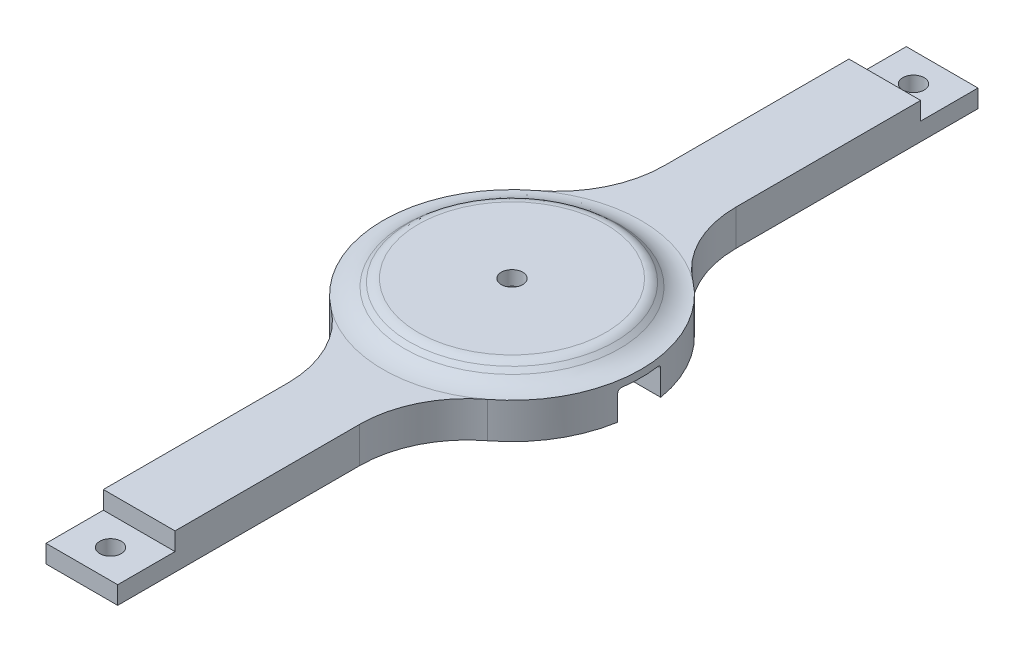
ISO-10303-21;
HEADER;
FILE_DESCRIPTION(('STEP AP214'),'2;1');
FILE_NAME('part.step','',(''),(''),'','','');
FILE_SCHEMA(('AUTOMOTIVE_DESIGN { 1 0 10303 214 1 1 1 1 }'));
ENDSEC;
DATA;
#1=APPLICATION_CONTEXT('core data for automotive mechanical design processes');
#2=APPLICATION_PROTOCOL_DEFINITION('international standard','automotive_design',2000,#1);
#3=PRODUCT_CONTEXT('',#1,'mechanical');
#4=PRODUCT('Part','Part','',(#3));
#5=PRODUCT_RELATED_PRODUCT_CATEGORY('part','',(#4));
#6=PRODUCT_DEFINITION_FORMATION('','',#4);
#7=PRODUCT_DEFINITION_CONTEXT('part definition',#1,'design');
#8=PRODUCT_DEFINITION('design','',#6,#7);
#9=PRODUCT_DEFINITION_SHAPE('','',#8);
#10=(LENGTH_UNIT() NAMED_UNIT(*) SI_UNIT(.MILLI.,.METRE.));
#11=(NAMED_UNIT(*) PLANE_ANGLE_UNIT() SI_UNIT($,.RADIAN.));
#12=(NAMED_UNIT(*) SI_UNIT($,.STERADIAN.) SOLID_ANGLE_UNIT());
#13=UNCERTAINTY_MEASURE_WITH_UNIT(LENGTH_MEASURE(1.E-05),#10,'distance_accuracy_value','');
#14=(GEOMETRIC_REPRESENTATION_CONTEXT(3) GLOBAL_UNCERTAINTY_ASSIGNED_CONTEXT((#13)) GLOBAL_UNIT_ASSIGNED_CONTEXT((#10,
#11,#12)) REPRESENTATION_CONTEXT('',''));
#15=CARTESIAN_POINT('',(0.,0.,0.));
#16=DIRECTION('',(0.,0.,1.));
#17=DIRECTION('',(1.,0.,0.));
#18=AXIS2_PLACEMENT_3D('',#15,#16,#17);
#19=CARTESIAN_POINT('',(0.,-5.,0.));
#20=DIRECTION('',(0.,-1.,0.));
#21=DIRECTION('',(0.,0.,-1.));
#22=AXIS2_PLACEMENT_3D('',#19,#20,#21);
#23=PLANE('',#22);
#24=CARTESIAN_POINT('',(0.,-5.,56.));
#25=DIRECTION('',(0.,-1.,0.));
#26=DIRECTION('',(0.,0.,-1.));
#27=AXIS2_PLACEMENT_3D('',#24,#25,#26);
#28=CIRCLE('',#27,1.5);
#29=CARTESIAN_POINT('',(0.,-5.,54.5));
#30=VERTEX_POINT('',#29);
#31=EDGE_CURVE('E181',#30,#30,#28,.T.);
#32=ORIENTED_EDGE('',*,*,#31,.F.);
#33=EDGE_LOOP('',(#32));
#34=FACE_BOUND('',#33,.T.);
#35=CARTESIAN_POINT('',(0.,-5.,-56.));
#36=DIRECTION('',(0.,1.,0.));
#37=DIRECTION('',(0.,0.,1.));
#38=AXIS2_PLACEMENT_3D('',#35,#36,#37);
#39=CIRCLE('',#38,1.5);
#40=CARTESIAN_POINT('',(0.,-5.,-54.5));
#41=VERTEX_POINT('',#40);
#42=EDGE_CURVE('E184',#41,#41,#39,.T.);
#43=ORIENTED_EDGE('',*,*,#42,.T.);
#44=EDGE_LOOP('',(#43));
#45=FACE_BOUND('',#44,.T.);
#46=CARTESIAN_POINT('',(0.,-5.,0.));
#47=DIRECTION('',(0.,1.,0.));
#48=DIRECTION('',(0.,0.,1.));
#49=AXIS2_PLACEMENT_3D('',#46,#47,#48);
#50=CIRCLE('',#49,18.);
#51=CARTESIAN_POINT('',(17.7482393492989,-5.,-3.));
#52=VERTEX_POINT('',#51);
#53=CARTESIAN_POINT('',(10.9090909090909,-5.,-14.3175324528073));
#54=VERTEX_POINT('',#53);
#55=EDGE_CURVE('E171',#52,#54,#50,.T.);
#56=ORIENTED_EDGE('',*,*,#55,.F.);
#57=DIRECTION('',(-1.,0.,0.));
#58=VECTOR('',#57,1.);
#59=CARTESIAN_POINT('',(0.,-5.,-3.));
#60=LINE('',#59,#58);
#61=CARTESIAN_POINT('',(10.2187327981507,-5.,-2.99999999999999));
#62=VERTEX_POINT('',#61);
#63=EDGE_CURVE('E525',#52,#62,#60,.T.);
#64=ORIENTED_EDGE('',*,*,#63,.T.);
#65=CARTESIAN_POINT('',(0.,-5.,0.));
#66=DIRECTION('',(0.,-1.,0.));
#67=DIRECTION('',(0.,0.,-1.));
#68=AXIS2_PLACEMENT_3D('',#65,#66,#67);
#69=CIRCLE('',#68,10.65);
#70=CARTESIAN_POINT('',(10.2187327981507,-5.,3.00000000000001));
#71=VERTEX_POINT('',#70);
#72=EDGE_CURVE('E328',#71,#62,#69,.T.);
#73=ORIENTED_EDGE('',*,*,#72,.F.);
#74=DIRECTION('',(1.,0.,0.));
#75=VECTOR('',#74,1.);
#76=CARTESIAN_POINT('',(0.,-5.,3.));
#77=LINE('',#76,#75);
#78=CARTESIAN_POINT('',(17.7482393492989,-5.,3.));
#79=VERTEX_POINT('',#78);
#80=EDGE_CURVE('E512',#71,#79,#77,.T.);
#81=ORIENTED_EDGE('',*,*,#80,.T.);
#82=CARTESIAN_POINT('',(10.9090909090909,-5.,14.3175324528073));
#83=VERTEX_POINT('',#82);
#84=EDGE_CURVE('E167',#83,#79,#50,.T.);
#85=ORIENTED_EDGE('',*,*,#84,.F.);
#86=CARTESIAN_POINT('',(20.,-5.,26.2488094968134));
#87=DIRECTION('',(0.,-1.,0.));
#88=DIRECTION('',(0.,0.,-1.));
#89=AXIS2_PLACEMENT_3D('',#86,#87,#88);
#90=CIRCLE('',#89,15.);
#91=CARTESIAN_POINT('',(5.,-5.,26.2488094968134));
#92=VERTEX_POINT('',#91);
#93=EDGE_CURVE('E12',#83,#92,#90,.F.);
#94=ORIENTED_EDGE('',*,*,#93,.T.);
#95=DIRECTION('',(0.,0.,-1.));
#96=VECTOR('',#95,1.);
#97=CARTESIAN_POINT('',(5.00000000000001,-5.,0.));
#98=LINE('',#97,#96);
#99=CARTESIAN_POINT('',(5.,-5.,60.));
#100=VERTEX_POINT('',#99);
#101=EDGE_CURVE('E123',#100,#92,#98,.T.);
#102=ORIENTED_EDGE('',*,*,#101,.F.);
#103=DIRECTION('',(1.,0.,0.));
#104=VECTOR('',#103,1.);
#105=CARTESIAN_POINT('',(45.,-5.,60.));
#106=LINE('',#105,#104);
#107=CARTESIAN_POINT('',(-5.,-5.,60.));
#108=VERTEX_POINT('',#107);
#109=EDGE_CURVE('E187',#108,#100,#106,.T.);
#110=ORIENTED_EDGE('',*,*,#109,.F.);
#111=DIRECTION('',(0.,0.,-1.));
#112=VECTOR('',#111,1.);
#113=CARTESIAN_POINT('',(-5.00000000000001,-5.,0.));
#114=LINE('',#113,#112);
#115=CARTESIAN_POINT('',(-5.,-5.,26.2488094968134));
#116=VERTEX_POINT('',#115);
#117=EDGE_CURVE('E353',#108,#116,#114,.T.);
#118=ORIENTED_EDGE('',*,*,#117,.T.);
#119=CARTESIAN_POINT('',(-20.,-5.,26.2488094968134));
#120=DIRECTION('',(0.,-1.,0.));
#121=DIRECTION('',(0.,0.,-1.));
#122=AXIS2_PLACEMENT_3D('',#119,#120,#121);
#123=CIRCLE('',#122,15.);
#124=CARTESIAN_POINT('',(-10.9090909090909,-5.,14.3175324528073));
#125=VERTEX_POINT('',#124);
#126=EDGE_CURVE('E113',#116,#125,#123,.F.);
#127=ORIENTED_EDGE('',*,*,#126,.T.);
#128=CARTESIAN_POINT('',(0.,-5.,0.));
#129=DIRECTION('',(0.,-1.,0.));
#130=DIRECTION('',(0.,0.,1.));
#131=AXIS2_PLACEMENT_3D('',#128,#129,#130);
#132=CIRCLE('',#131,18.);
#133=CARTESIAN_POINT('',(-10.9090909090909,-5.,-14.3175324528073));
#134=VERTEX_POINT('',#133);
#135=EDGE_CURVE('E362',#125,#134,#132,.T.);
#136=ORIENTED_EDGE('',*,*,#135,.T.);
#137=CARTESIAN_POINT('',(-20.,-5.,-26.2488094968134));
#138=DIRECTION('',(0.,-1.,0.));
#139=DIRECTION('',(0.,0.,-1.));
#140=AXIS2_PLACEMENT_3D('',#137,#138,#139);
#141=CIRCLE('',#140,15.);
#142=CARTESIAN_POINT('',(-5.,-5.,-26.2488094968134));
#143=VERTEX_POINT('',#142);
#144=EDGE_CURVE('E469',#134,#143,#141,.F.);
#145=ORIENTED_EDGE('',*,*,#144,.T.);
#146=DIRECTION('',(0.,0.,1.));
#147=VECTOR('',#146,1.);
#148=CARTESIAN_POINT('',(-5.00000000000001,-5.,0.));
#149=LINE('',#148,#147);
#150=CARTESIAN_POINT('',(-5.,-5.,-60.));
#151=VERTEX_POINT('',#150);
#152=EDGE_CURVE('E137',#151,#143,#149,.T.);
#153=ORIENTED_EDGE('',*,*,#152,.F.);
#154=DIRECTION('',(-1.,0.,0.));
#155=VECTOR('',#154,1.);
#156=CARTESIAN_POINT('',(-45.,-5.,-60.));
#157=LINE('',#156,#155);
#158=CARTESIAN_POINT('',(5.,-5.,-60.));
#159=VERTEX_POINT('',#158);
#160=EDGE_CURVE('E190',#159,#151,#157,.T.);
#161=ORIENTED_EDGE('',*,*,#160,.F.);
#162=DIRECTION('',(0.,0.,1.));
#163=VECTOR('',#162,1.);
#164=CARTESIAN_POINT('',(5.00000000000001,-5.,0.));
#165=LINE('',#164,#163);
#166=CARTESIAN_POINT('',(5.,-5.,-26.2488094968134));
#167=VERTEX_POINT('',#166);
#168=EDGE_CURVE('E170',#159,#167,#165,.T.);
#169=ORIENTED_EDGE('',*,*,#168,.T.);
#170=CARTESIAN_POINT('',(20.,-5.,-26.2488094968134));
#171=DIRECTION('',(0.,-1.,0.));
#172=DIRECTION('',(0.,0.,-1.));
#173=AXIS2_PLACEMENT_3D('',#170,#171,#172);
#174=CIRCLE('',#173,15.);
#175=EDGE_CURVE('E466',#167,#54,#174,.F.);
#176=ORIENTED_EDGE('',*,*,#175,.T.);
#177=EDGE_LOOP('',(#56,#64,#73,#81,#85,#94,#102,#110,#118,#127,#136,#145,#153,#161,#169,#176));
#178=FACE_BOUND('',#177,.T.);
#179=ADVANCED_FACE('F45',(#34,#45,#178),#23,.T.);
#180=CARTESIAN_POINT('',(0.,-5.,0.));
#181=DIRECTION('',(0.,1.,0.));
#182=DIRECTION('',(0.,0.,1.));
#183=AXIS2_PLACEMENT_3D('',#180,#181,#182);
#184=CYLINDRICAL_SURFACE('',#183,18.);
#185=ORIENTED_EDGE('',*,*,#55,.T.);
#186=DIRECTION('',(0.,1.,0.));
#187=VECTOR('',#186,1.);
#188=CARTESIAN_POINT('',(10.9090909090909,-5.,-14.3175324528073));
#189=LINE('',#188,#187);
#190=CARTESIAN_POINT('',(10.9090909090909,0.,-14.3175324528073));
#191=VERTEX_POINT('',#190);
#192=EDGE_CURVE('E454',#54,#191,#189,.T.);
#193=ORIENTED_EDGE('',*,*,#192,.T.);
#194=CARTESIAN_POINT('',(0.,0.,0.));
#195=DIRECTION('',(0.,1.,0.));
#196=DIRECTION('',(0.,0.,1.));
#197=AXIS2_PLACEMENT_3D('',#194,#195,#196);
#198=CIRCLE('',#197,18.);
#199=CARTESIAN_POINT('',(10.9090909090909,0.,14.3175324528073));
#200=VERTEX_POINT('',#199);
#201=EDGE_CURVE('E166',#200,#191,#198,.T.);
#202=ORIENTED_EDGE('',*,*,#201,.F.);
#203=DIRECTION('',(0.,1.,0.));
#204=VECTOR('',#203,1.);
#205=CARTESIAN_POINT('',(10.9090909090909,-5.,14.3175324528073));
#206=LINE('',#205,#204);
#207=EDGE_CURVE('E111',#200,#83,#206,.F.);
#208=ORIENTED_EDGE('',*,*,#207,.T.);
#209=ORIENTED_EDGE('',*,*,#84,.T.);
#210=DIRECTION('',(0.,1.,0.));
#211=VECTOR('',#210,1.);
#212=CARTESIAN_POINT('',(17.7482393492989,-5.,3.));
#213=LINE('',#212,#211);
#214=CARTESIAN_POINT('',(17.7482393492989,-1.5,3.));
#215=VERTEX_POINT('',#214);
#216=EDGE_CURVE('E516',#79,#215,#213,.T.);
#217=ORIENTED_EDGE('',*,*,#216,.T.);
#218=CARTESIAN_POINT('',(17.7482393492989,-1.5,3.));
#219=CARTESIAN_POINT('',(17.7482332357757,-1.47214135832498,3.00002511288223));
#220=CARTESIAN_POINT('',(17.7486326132973,-1.44429255025681,2.99767326426672));
#221=CARTESIAN_POINT('',(17.7501966128589,-1.38942090953694,2.98840421971169));
#222=CARTESIAN_POINT('',(17.7513603011444,-1.362397111079,2.98149259438176));
#223=CARTESIAN_POINT('',(17.7544078819667,-1.30990160032884,2.96328879130655));
#224=CARTESIAN_POINT('',(17.7562920073524,-1.28443039293085,2.95199519726994));
#225=CARTESIAN_POINT('',(17.7606971690626,-1.23575545229187,2.92537495091207));
#226=CARTESIAN_POINT('',(17.7632181746881,-1.21255160983329,2.91004849298285));
#227=CARTESIAN_POINT('',(17.7688125685304,-1.168891878979,2.87569184509768));
#228=CARTESIAN_POINT('',(17.7718895446955,-1.14845544439775,2.85663752711052));
#229=CARTESIAN_POINT('',(17.7784634775824,-1.1110586884189,2.81543440395894));
#230=CARTESIAN_POINT('',(17.7819605306431,-1.09409916682641,2.79328488876274));
#231=CARTESIAN_POINT('',(17.7892913883295,-1.06391380871787,2.74621301206353));
#232=CARTESIAN_POINT('',(17.7931289566603,-1.05073898527791,2.72125855286285));
#233=CARTESIAN_POINT('',(17.8009650265794,-1.02877550958106,2.66951815515013));
#234=CARTESIAN_POINT('',(17.8049634530886,-1.01998483614863,2.64273306708039));
#235=CARTESIAN_POINT('',(17.8117509263368,-1.00901865267783,2.59651580685795));
#236=CARTESIAN_POINT('',(17.8145332458628,-1.00563967750726,2.57735921652682));
#237=CARTESIAN_POINT('',(17.8200686895053,-1.00113040024699,2.53880584109007));
#238=CARTESIAN_POINT('',(17.8228218479138,-0.999997073888601,2.51940941447193));
#239=CARTESIAN_POINT('',(17.8255434699759,-1.,2.5));
#240=B_SPLINE_CURVE_WITH_KNOTS('',3,(#218,#219,#220,#221,#222,#223,#224,#225,#226,#227,#228,
#229,#230,#231,#232,#233,#234,#235,#236,#237,#238,#239),.UNSPECIFIED.,.F.,.F.,(4,2,2,2,2,2,2,2,
2,2,4),(0.,0.0834593783557437,0.166816984008042,0.250201554053615,0.333582105533117,
0.417521331287892,0.501479844231925,0.586521951437317,0.671524816307738,0.730352939897004,
0.789101784259888),.UNSPECIFIED.);
#241=CARTESIAN_POINT('',(17.8255434699759,-1.,2.5));
#242=VERTEX_POINT('',#241);
#243=EDGE_CURVE('E266',#215,#242,#240,.T.);
#244=ORIENTED_EDGE('',*,*,#243,.T.);
#245=CARTESIAN_POINT('',(0.,-1.,0.));
#246=DIRECTION('',(0.,-1.,0.));
#247=DIRECTION('',(0.,0.,-1.));
#248=AXIS2_PLACEMENT_3D('',#245,#246,#247);
#249=CIRCLE('',#248,18.);
#250=CARTESIAN_POINT('',(17.8255434699759,-1.,-2.5));
#251=VERTEX_POINT('',#250);
#252=EDGE_CURVE('E522',#242,#251,#249,.F.);
#253=ORIENTED_EDGE('',*,*,#252,.T.);
#254=CARTESIAN_POINT('',(17.8255434699759,-1.,-2.5));
#255=CARTESIAN_POINT('',(17.8215635041767,-0.999977456937952,-2.52839700167244));
#256=CARTESIAN_POINT('',(17.8175115342559,-1.00241778763535,-2.55677663968135));
#257=CARTESIAN_POINT('',(17.8093955318247,-1.01204807396821,-2.61270040708748));
#258=CARTESIAN_POINT('',(17.8053315075925,-1.01923529699408,-2.64024500764895));
#259=CARTESIAN_POINT('',(17.7973164977203,-1.03818827376845,-2.6937455264005));
#260=CARTESIAN_POINT('',(17.7933655685899,-1.04995627493401,-2.71970065752138));
#261=CARTESIAN_POINT('',(17.785719239699,-1.07773967941705,-2.76926319817921));
#262=CARTESIAN_POINT('',(17.7820237857132,-1.09375417789213,-2.79287110638999));
#263=CARTESIAN_POINT('',(17.7750370026888,-1.12954465799603,-2.83699817145587));
#264=CARTESIAN_POINT('',(17.7717445780707,-1.14931005218867,-2.85752573777014));
#265=CARTESIAN_POINT('',(17.765684059728,-1.19208871786546,-2.89496640162274));
#266=CARTESIAN_POINT('',(17.7629160507354,-1.21510251316101,-2.91187891511826));
#267=CARTESIAN_POINT('',(17.7580491141909,-1.26346494897521,-2.94141364187764));
#268=CARTESIAN_POINT('',(17.7559435238328,-1.28878680068963,-2.95407866914052));
#269=CARTESIAN_POINT('',(17.7524563316193,-1.34123906866283,-2.97496338839218));
#270=CARTESIAN_POINT('',(17.7510741668281,-1.36836806010287,-2.98318653700195));
#271=CARTESIAN_POINT('',(17.7494725122149,-1.41307955814933,-2.99269758357861));
#272=CARTESIAN_POINT('',(17.74901065486,-1.43035867540672,-2.99543428314725));
#273=CARTESIAN_POINT('',(17.7483939980804,-1.46508919604898,-2.99908512453727));
#274=CARTESIAN_POINT('',(17.7482387685522,-1.48254032355202,-3.00000181926998));
#275=CARTESIAN_POINT('',(17.7482393492989,-1.5,-3.));
#276=B_SPLINE_CURVE_WITH_KNOTS('',3,(#254,#255,#256,#257,#258,#259,#260,#261,#262,#263,#264,
#265,#266,#267,#268,#269,#270,#271,#272,#273,#274,#275),.UNSPECIFIED.,.F.,.F.,(4,2,2,2,2,2,2,2,
2,2,4),(0.,0.0859098990105212,0.171770385938038,0.257673050858917,0.343557426353802,
0.42920289280652,0.514862185578664,0.599630096797464,0.684331947180204,0.736743153169506,
0.789080790145875),.UNSPECIFIED.);
#277=CARTESIAN_POINT('',(17.7482393492989,-1.5,-3.));
#278=VERTEX_POINT('',#277);
#279=EDGE_CURVE('E231',#251,#278,#276,.T.);
#280=ORIENTED_EDGE('',*,*,#279,.T.);
#281=DIRECTION('',(0.,1.,0.));
#282=VECTOR('',#281,1.);
#283=CARTESIAN_POINT('',(17.7482393492989,-5.,-3.));
#284=LINE('',#283,#282);
#285=EDGE_CURVE('E531',#278,#52,#284,.F.);
#286=ORIENTED_EDGE('',*,*,#285,.T.);
#287=EDGE_LOOP('',(#185,#193,#202,#208,#209,#217,#244,#253,#280,#286));
#288=FACE_BOUND('',#287,.T.);
#289=ADVANCED_FACE('F274',(#288),#184,.T.);
#290=CARTESIAN_POINT('',(0.,32.1227488785469,0.));
#291=DIRECTION('',(0.,-1.,0.));
#292=DIRECTION('',(0.,0.,-1.));
#293=AXIS2_PLACEMENT_3D('',#290,#291,#292);
#294=CYLINDRICAL_SURFACE('',#293,10.65);
#295=CARTESIAN_POINT('',(0.,0.,0.));
#296=DIRECTION('',(0.,1.,0.));
#297=DIRECTION('',(0.,0.,1.));
#298=AXIS2_PLACEMENT_3D('',#295,#296,#297);
#299=CIRCLE('',#298,10.65);
#300=CARTESIAN_POINT('',(0.,0.,10.65));
#301=VERTEX_POINT('',#300);
#302=EDGE_CURVE('E323',#301,#301,#299,.F.);
#303=ORIENTED_EDGE('',*,*,#302,.F.);
#304=EDGE_LOOP('',(#303));
#305=FACE_BOUND('',#304,.T.);
#306=DIRECTION('',(0.,-1.,0.));
#307=VECTOR('',#306,1.);
#308=CARTESIAN_POINT('',(10.2187327981507,32.1227488785469,-2.99999999999999));
#309=LINE('',#308,#307);
#310=CARTESIAN_POINT('',(10.2187327981507,-1.49999999999999,-2.99999999999999));
#311=VERTEX_POINT('',#310);
#312=EDGE_CURVE('E207',#311,#62,#309,.T.);
#313=ORIENTED_EDGE('',*,*,#312,.F.);
#314=CARTESIAN_POINT('',(10.2187327981507,-1.5,-3.));
#315=CARTESIAN_POINT('',(10.2187216681149,-1.47265123474762,-3.00002723235999));
#316=CARTESIAN_POINT('',(10.21939098074,-1.44531736900103,-2.99775795991905));
#317=CARTESIAN_POINT('',(10.2220053952499,-1.39149177379419,-2.98883657551772));
#318=CARTESIAN_POINT('',(10.2239479183332,-1.36499845533774,-2.98219332263549));
#319=CARTESIAN_POINT('',(10.2290243455867,-1.31354910237764,-2.96473240172497));
#320=CARTESIAN_POINT('',(10.2321582791716,-1.28859310584649,-2.95391463063221));
#321=CARTESIAN_POINT('',(10.239470309353,-1.24087393858463,-2.92846779080597));
#322=CARTESIAN_POINT('',(10.2436486008867,-1.21811117833813,-2.91383801051077));
#323=CARTESIAN_POINT('',(10.2529607445105,-1.17493786837911,-2.88090144867071));
#324=CARTESIAN_POINT('',(10.2581112551699,-1.15458027358462,-2.86253004126005));
#325=CARTESIAN_POINT('',(10.2691077706384,-1.11721206123179,-2.82282650574179));
#326=CARTESIAN_POINT('',(10.2749539698289,-1.10020238264967,-2.80149354987367));
#327=CARTESIAN_POINT('',(10.2873564650718,-1.06935338448562,-2.75560913679629));
#328=CARTESIAN_POINT('',(10.2939311047944,-1.05565583599915,-2.73096736434357));
#329=CARTESIAN_POINT('',(10.3073683620234,-1.03260633997964,-2.67980524965893));
#330=CARTESIAN_POINT('',(10.3142309139835,-1.02325340914042,-2.6532853340698));
#331=CARTESIAN_POINT('',(10.3263630450094,-1.01081651023281,-2.60560490001243));
#332=CARTESIAN_POINT('',(10.3316192735973,-1.0067663221816,-2.58468732388586));
#333=CARTESIAN_POINT('',(10.3420773718742,-1.00135767947077,-2.54252117538642));
#334=CARTESIAN_POINT('',(10.3472792996172,-0.999995975331516,-2.52127303391849));
#335=CARTESIAN_POINT('',(10.3524151771459,-1.,-2.5));
#336=B_SPLINE_CURVE_WITH_KNOTS('',3,(#314,#315,#316,#317,#318,#319,#320,#321,#322,#323,#324,
#325,#326,#327,#328,#329,#330,#331,#332,#333,#334,#335),.UNSPECIFIED.,.F.,.F.,(4,2,2,2,2,2,2,2,
2,2,4),(0.,0.0819213543459317,0.163677293160185,0.245435250571485,0.327208480128655,
0.410536558991545,0.493887975338273,0.58034560735258,0.666783662086927,0.732457241867842,
0.798051395500657),.UNSPECIFIED.);
#337=CARTESIAN_POINT('',(10.3524151771459,-1.,-2.5));
#338=VERTEX_POINT('',#337);
#339=EDGE_CURVE('E222',#311,#338,#336,.T.);
#340=ORIENTED_EDGE('',*,*,#339,.T.);
#341=CARTESIAN_POINT('',(0.,-1.,0.));
#342=DIRECTION('',(0.,-1.,0.));
#343=DIRECTION('',(0.,0.,-1.));
#344=AXIS2_PLACEMENT_3D('',#341,#342,#343);
#345=CIRCLE('',#344,10.65);
#346=CARTESIAN_POINT('',(10.3524151771459,-1.,2.5));
#347=VERTEX_POINT('',#346);
#348=EDGE_CURVE('E204',#347,#338,#345,.F.);
#349=ORIENTED_EDGE('',*,*,#348,.F.);
#350=CARTESIAN_POINT('',(10.3524151771459,-1.,2.5));
#351=CARTESIAN_POINT('',(10.3454343325229,-0.999980281946966,2.52892781124622));
#352=CARTESIAN_POINT('',(10.3383248237783,-1.00250916693394,2.5578169113411));
#353=CARTESIAN_POINT('',(10.3240771123011,-1.01248791707786,2.61472078724759));
#354=CARTESIAN_POINT('',(10.3169389146012,-1.01993695361714,2.6427357094503));
#355=CARTESIAN_POINT('',(10.3028563936668,-1.03958486213823,2.69711835722431));
#356=CARTESIAN_POINT('',(10.2959121703587,-1.05178613558869,2.72348524215571));
#357=CARTESIAN_POINT('',(10.2824731472749,-1.08062220563352,2.77379205872506));
#358=CARTESIAN_POINT('',(10.275978223524,-1.09725577302979,2.7977326607016));
#359=CARTESIAN_POINT('',(10.2637458479178,-1.13437925528972,2.84227931457306));
#360=CARTESIAN_POINT('',(10.258002472198,-1.15483547947986,2.8629117751064));
#361=CARTESIAN_POINT('',(10.2474592878025,-1.1991624620506,2.90042389180111));
#362=CARTESIAN_POINT('',(10.242659551167,-1.22303348088675,2.91730326145308));
#363=CARTESIAN_POINT('',(10.234369230379,-1.27271328715774,2.94625303555491));
#364=CARTESIAN_POINT('',(10.2308423533612,-1.29843797277804,2.95845749343106));
#365=CARTESIAN_POINT('',(10.2250709126481,-1.3517007868774,2.97834404216604));
#366=CARTESIAN_POINT('',(10.2228248533034,-1.37923675816273,2.98603140808974));
#367=CARTESIAN_POINT('',(10.2204324809542,-1.422518323038,2.99420578714402));
#368=CARTESIAN_POINT('',(10.2197958175825,-1.43793798289639,2.99637732354933));
#369=CARTESIAN_POINT('',(10.2189459942328,-1.46890241044947,2.99927386445812));
#370=CARTESIAN_POINT('',(10.2187322463941,-1.48444697428427,3.0000008768832));
#371=CARTESIAN_POINT('',(10.2187327981508,-1.49999999999998,3.00000000000015));
#372=B_SPLINE_CURVE_WITH_KNOTS('',3,(#350,#351,#352,#353,#354,#355,#356,#357,#358,#359,#360,
#361,#362,#363,#364,#365,#366,#367,#368,#369,#370,#371),.UNSPECIFIED.,.F.,.F.,(4,2,2,2,2,2,2,2,
2,2,4),(0.,0.0891573340457603,0.178299656661376,0.267487084524182,0.356649803934277,
0.445060890207362,0.533478723430662,0.619127443851032,0.704675943792061,0.751364968066516,
0.797989047992606),.UNSPECIFIED.);
#373=CARTESIAN_POINT('',(10.2187327981507,-1.49999999999999,3.00000000000001));
#374=VERTEX_POINT('',#373);
#375=EDGE_CURVE('E260',#347,#374,#372,.T.);
#376=ORIENTED_EDGE('',*,*,#375,.T.);
#377=DIRECTION('',(0.,-1.,0.));
#378=VECTOR('',#377,1.);
#379=CARTESIAN_POINT('',(10.2187327981507,32.1227488785469,3.00000000000001));
#380=LINE('',#379,#378);
#381=EDGE_CURVE('E201',#71,#374,#380,.F.);
#382=ORIENTED_EDGE('',*,*,#381,.F.);
#383=ORIENTED_EDGE('',*,*,#72,.T.);
#384=EDGE_LOOP('',(#313,#340,#349,#376,#382,#383));
#385=FACE_BOUND('',#384,.T.);
#386=ADVANCED_FACE('F238',(#305,#385),#294,.F.);
#387=CARTESIAN_POINT('',(0.,0.,0.));
#388=DIRECTION('',(0.,-1.,0.));
#389=DIRECTION('',(0.,0.,-1.));
#390=AXIS2_PLACEMENT_3D('',#387,#388,#389);
#391=PLANE('',#390);
#392=DIRECTION('',(0.,0.,1.));
#393=VECTOR('',#392,1.);
#394=CARTESIAN_POINT('',(-5.00000000000001,0.,0.));
#395=LINE('',#394,#393);
#396=CARTESIAN_POINT('',(-5.,0.,-52.));
#397=VERTEX_POINT('',#396);
#398=CARTESIAN_POINT('',(-5.,0.,-26.2488094968134));
#399=VERTEX_POINT('',#398);
#400=EDGE_CURVE('E365',#397,#399,#395,.T.);
#401=ORIENTED_EDGE('',*,*,#400,.T.);
#402=CARTESIAN_POINT('',(-20.,0.,-26.2488094968134));
#403=DIRECTION('',(0.,-1.,0.));
#404=DIRECTION('',(0.,0.,-1.));
#405=AXIS2_PLACEMENT_3D('',#402,#403,#404);
#406=CIRCLE('',#405,15.);
#407=CARTESIAN_POINT('',(-10.9090909090909,0.,-14.3175324528073));
#408=VERTEX_POINT('',#407);
#409=EDGE_CURVE('E89',#399,#408,#406,.T.);
#410=ORIENTED_EDGE('',*,*,#409,.T.);
#411=CARTESIAN_POINT('',(0.,0.,0.));
#412=DIRECTION('',(0.,-1.,0.));
#413=DIRECTION('',(0.,0.,-1.));
#414=AXIS2_PLACEMENT_3D('',#411,#412,#413);
#415=CIRCLE('',#414,18.);
#416=EDGE_CURVE('E66',#408,#191,#415,.T.);
#417=ORIENTED_EDGE('',*,*,#416,.T.);
#418=CARTESIAN_POINT('',(20.,0.,-26.2488094968134));
#419=DIRECTION('',(0.,-1.,0.));
#420=DIRECTION('',(0.,0.,-1.));
#421=AXIS2_PLACEMENT_3D('',#418,#419,#420);
#422=CIRCLE('',#421,15.);
#423=CARTESIAN_POINT('',(5.,0.,-26.2488094968134));
#424=VERTEX_POINT('',#423);
#425=EDGE_CURVE('E124',#191,#424,#422,.T.);
#426=ORIENTED_EDGE('',*,*,#425,.T.);
#427=DIRECTION('',(0.,0.,1.));
#428=VECTOR('',#427,1.);
#429=CARTESIAN_POINT('',(5.00000000000001,0.,0.));
#430=LINE('',#429,#428);
#431=CARTESIAN_POINT('',(5.,0.,-52.));
#432=VERTEX_POINT('',#431);
#433=EDGE_CURVE('E176',#432,#424,#430,.T.);
#434=ORIENTED_EDGE('',*,*,#433,.F.);
#435=DIRECTION('',(1.,0.,0.));
#436=VECTOR('',#435,1.);
#437=CARTESIAN_POINT('',(-5.,0.,-52.));
#438=LINE('',#437,#436);
#439=EDGE_CURVE('E142',#397,#432,#438,.T.);
#440=ORIENTED_EDGE('',*,*,#439,.F.);
#441=EDGE_LOOP('',(#401,#410,#417,#426,#434,#440));
#442=FACE_BOUND('',#441,.T.);
#443=ADVANCED_FACE('F298',(#442),#391,.F.);
#444=DIRECTION('',(0.,0.,-1.));
#445=VECTOR('',#444,1.);
#446=CARTESIAN_POINT('',(5.00000000000001,0.,0.));
#447=LINE('',#446,#445);
#448=CARTESIAN_POINT('',(5.,0.,52.));
#449=VERTEX_POINT('',#448);
#450=CARTESIAN_POINT('',(5.,0.,26.2488094968134));
#451=VERTEX_POINT('',#450);
#452=EDGE_CURVE('E120',#449,#451,#447,.T.);
#453=ORIENTED_EDGE('',*,*,#452,.T.);
#454=CARTESIAN_POINT('',(20.,0.,26.2488094968134));
#455=DIRECTION('',(0.,-1.,0.));
#456=DIRECTION('',(0.,0.,-1.));
#457=AXIS2_PLACEMENT_3D('',#454,#455,#456);
#458=CIRCLE('',#457,15.);
#459=EDGE_CURVE('E53',#451,#200,#458,.T.);
#460=ORIENTED_EDGE('',*,*,#459,.T.);
#461=CARTESIAN_POINT('',(0.,0.,0.));
#462=DIRECTION('',(0.,-1.,0.));
#463=DIRECTION('',(0.,0.,-1.));
#464=AXIS2_PLACEMENT_3D('',#461,#462,#463);
#465=CIRCLE('',#464,18.);
#466=CARTESIAN_POINT('',(-10.9090909090909,0.,14.3175324528073));
#467=VERTEX_POINT('',#466);
#468=EDGE_CURVE('E60',#200,#467,#465,.T.);
#469=ORIENTED_EDGE('',*,*,#468,.T.);
#470=CARTESIAN_POINT('',(-20.,0.,26.2488094968134));
#471=DIRECTION('',(0.,-1.,0.));
#472=DIRECTION('',(0.,0.,-1.));
#473=AXIS2_PLACEMENT_3D('',#470,#471,#472);
#474=CIRCLE('',#473,15.);
#475=CARTESIAN_POINT('',(-5.,0.,26.2488094968134));
#476=VERTEX_POINT('',#475);
#477=EDGE_CURVE('E471',#467,#476,#474,.T.);
#478=ORIENTED_EDGE('',*,*,#477,.T.);
#479=DIRECTION('',(0.,0.,-1.));
#480=VECTOR('',#479,1.);
#481=CARTESIAN_POINT('',(-5.00000000000001,0.,0.));
#482=LINE('',#481,#480);
#483=CARTESIAN_POINT('',(-5.,0.,52.));
#484=VERTEX_POINT('',#483);
#485=EDGE_CURVE('E352',#484,#476,#482,.T.);
#486=ORIENTED_EDGE('',*,*,#485,.F.);
#487=DIRECTION('',(1.,0.,0.));
#488=VECTOR('',#487,1.);
#489=CARTESIAN_POINT('',(-5.,0.,52.));
#490=LINE('',#489,#488);
#491=EDGE_CURVE('E131',#484,#449,#490,.T.);
#492=ORIENTED_EDGE('',*,*,#491,.T.);
#493=EDGE_LOOP('',(#453,#460,#469,#478,#486,#492));
#494=FACE_BOUND('',#493,.T.);
#495=ADVANCED_FACE('F128',(#494),#391,.F.);
#496=CARTESIAN_POINT('',(45.,-5.,60.));
#497=DIRECTION('',(0.,0.,1.));
#498=DIRECTION('',(1.,0.,0.));
#499=AXIS2_PLACEMENT_3D('',#496,#497,#498);
#500=PLANE('',#499);
#501=DIRECTION('',(0.,1.,0.));
#502=VECTOR('',#501,1.);
#503=CARTESIAN_POINT('',(5.,-5.,60.));
#504=LINE('',#503,#502);
#505=CARTESIAN_POINT('',(5.,-2.5,60.));
#506=VERTEX_POINT('',#505);
#507=EDGE_CURVE('E134',#100,#506,#504,.T.);
#508=ORIENTED_EDGE('',*,*,#507,.T.);
#509=DIRECTION('',(-1.,0.,0.));
#510=VECTOR('',#509,1.);
#511=CARTESIAN_POINT('',(-5.,-2.5,60.));
#512=LINE('',#511,#510);
#513=CARTESIAN_POINT('',(-5.,-2.5,60.));
#514=VERTEX_POINT('',#513);
#515=EDGE_CURVE('E334',#506,#514,#512,.T.);
#516=ORIENTED_EDGE('',*,*,#515,.T.);
#517=DIRECTION('',(0.,1.,0.));
#518=VECTOR('',#517,1.);
#519=CARTESIAN_POINT('',(-5.,-5.,60.));
#520=LINE('',#519,#518);
#521=EDGE_CURVE('E356',#108,#514,#520,.T.);
#522=ORIENTED_EDGE('',*,*,#521,.F.);
#523=ORIENTED_EDGE('',*,*,#109,.T.);
#524=EDGE_LOOP('',(#508,#516,#522,#523));
#525=FACE_BOUND('',#524,.T.);
#526=ADVANCED_FACE('F286',(#525),#500,.T.);
#527=CARTESIAN_POINT('',(0.,-5.,56.));
#528=DIRECTION('',(0.,1.,0.));
#529=DIRECTION('',(0.,0.,1.));
#530=AXIS2_PLACEMENT_3D('',#527,#528,#529);
#531=CYLINDRICAL_SURFACE('',#530,1.5);
#532=ORIENTED_EDGE('',*,*,#31,.T.);
#533=EDGE_LOOP('',(#532));
#534=FACE_BOUND('',#533,.T.);
#535=CARTESIAN_POINT('',(0.,-2.5,56.));
#536=DIRECTION('',(0.,1.,0.));
#537=DIRECTION('',(0.,0.,1.));
#538=AXIS2_PLACEMENT_3D('',#535,#536,#537);
#539=CIRCLE('',#538,1.5);
#540=CARTESIAN_POINT('',(0.,-2.5,57.5));
#541=VERTEX_POINT('',#540);
#542=EDGE_CURVE('E347',#541,#541,#539,.T.);
#543=ORIENTED_EDGE('',*,*,#542,.T.);
#544=EDGE_LOOP('',(#543));
#545=FACE_BOUND('',#544,.T.);
#546=ADVANCED_FACE('F282',(#534,#545),#531,.F.);
#547=CARTESIAN_POINT('',(5.00000000000001,-5.,0.));
#548=DIRECTION('',(1.,0.,0.));
#549=DIRECTION('',(0.,0.,-1.));
#550=AXIS2_PLACEMENT_3D('',#547,#548,#549);
#551=PLANE('',#550);
#552=ORIENTED_EDGE('',*,*,#101,.T.);
#553=DIRECTION('',(0.,-1.,0.));
#554=VECTOR('',#553,1.);
#555=CARTESIAN_POINT('',(5.,0.,26.2488094968134));
#556=LINE('',#555,#554);
#557=EDGE_CURVE('E109',#92,#451,#556,.F.);
#558=ORIENTED_EDGE('',*,*,#557,.T.);
#559=ORIENTED_EDGE('',*,*,#452,.F.);
#560=DIRECTION('',(0.,1.,0.));
#561=VECTOR('',#560,1.);
#562=CARTESIAN_POINT('',(5.,-2.5,52.));
#563=LINE('',#562,#561);
#564=CARTESIAN_POINT('',(5.,-2.5,52.));
#565=VERTEX_POINT('',#564);
#566=EDGE_CURVE('E342',#565,#449,#563,.T.);
#567=ORIENTED_EDGE('',*,*,#566,.F.);
#568=DIRECTION('',(0.,0.,1.));
#569=VECTOR('',#568,1.);
#570=CARTESIAN_POINT('',(5.,-2.5,60.));
#571=LINE('',#570,#569);
#572=EDGE_CURVE('E337',#565,#506,#571,.T.);
#573=ORIENTED_EDGE('',*,*,#572,.T.);
#574=ORIENTED_EDGE('',*,*,#507,.F.);
#575=EDGE_LOOP('',(#552,#558,#559,#567,#573,#574));
#576=FACE_BOUND('',#575,.T.);
#577=ADVANCED_FACE('F117',(#576),#551,.T.);
#578=CARTESIAN_POINT('',(-5.00000000000001,-5.,0.));
#579=DIRECTION('',(1.,0.,0.));
#580=DIRECTION('',(0.,0.,-1.));
#581=AXIS2_PLACEMENT_3D('',#578,#579,#580);
#582=PLANE('',#581);
#583=ORIENTED_EDGE('',*,*,#485,.T.);
#584=DIRECTION('',(0.,-1.,0.));
#585=VECTOR('',#584,1.);
#586=CARTESIAN_POINT('',(-5.,-5.,26.2488094968134));
#587=LINE('',#586,#585);
#588=EDGE_CURVE('E125',#476,#116,#587,.T.);
#589=ORIENTED_EDGE('',*,*,#588,.T.);
#590=ORIENTED_EDGE('',*,*,#117,.F.);
#591=ORIENTED_EDGE('',*,*,#521,.T.);
#592=DIRECTION('',(0.,0.,-1.));
#593=VECTOR('',#592,1.);
#594=CARTESIAN_POINT('',(-5.,-2.5,60.));
#595=LINE('',#594,#593);
#596=CARTESIAN_POINT('',(-5.,-2.5,52.));
#597=VERTEX_POINT('',#596);
#598=EDGE_CURVE('E325',#514,#597,#595,.T.);
#599=ORIENTED_EDGE('',*,*,#598,.T.);
#600=DIRECTION('',(0.,1.,0.));
#601=VECTOR('',#600,1.);
#602=CARTESIAN_POINT('',(-5.,-2.5,52.));
#603=LINE('',#602,#601);
#604=EDGE_CURVE('E344',#597,#484,#603,.T.);
#605=ORIENTED_EDGE('',*,*,#604,.T.);
#606=EDGE_LOOP('',(#583,#589,#590,#591,#599,#605));
#607=FACE_BOUND('',#606,.T.);
#608=ADVANCED_FACE('F301',(#607),#582,.F.);
#609=CARTESIAN_POINT('',(-45.,-5.,-60.));
#610=DIRECTION('',(0.,0.,-1.));
#611=DIRECTION('',(-1.,0.,0.));
#612=AXIS2_PLACEMENT_3D('',#609,#610,#611);
#613=PLANE('',#612);
#614=ORIENTED_EDGE('',*,*,#160,.T.);
#615=DIRECTION('',(0.,1.,0.));
#616=VECTOR('',#615,1.);
#617=CARTESIAN_POINT('',(-5.,-5.,-60.));
#618=LINE('',#617,#616);
#619=CARTESIAN_POINT('',(-5.,-2.5,-60.));
#620=VERTEX_POINT('',#619);
#621=EDGE_CURVE('E132',#151,#620,#618,.T.);
#622=ORIENTED_EDGE('',*,*,#621,.T.);
#623=DIRECTION('',(-1.,0.,0.));
#624=VECTOR('',#623,1.);
#625=CARTESIAN_POINT('',(-5.,-2.5,-60.));
#626=LINE('',#625,#624);
#627=CARTESIAN_POINT('',(5.,-2.5,-60.));
#628=VERTEX_POINT('',#627);
#629=EDGE_CURVE('E152',#628,#620,#626,.T.);
#630=ORIENTED_EDGE('',*,*,#629,.F.);
#631=DIRECTION('',(0.,1.,0.));
#632=VECTOR('',#631,1.);
#633=CARTESIAN_POINT('',(5.,-5.,-60.));
#634=LINE('',#633,#632);
#635=EDGE_CURVE('E174',#159,#628,#634,.T.);
#636=ORIENTED_EDGE('',*,*,#635,.F.);
#637=EDGE_LOOP('',(#614,#622,#630,#636));
#638=FACE_BOUND('',#637,.T.);
#639=ADVANCED_FACE('F291',(#638),#613,.T.);
#640=CARTESIAN_POINT('',(0.,-5.,-56.));
#641=DIRECTION('',(0.,1.,0.));
#642=DIRECTION('',(0.,0.,1.));
#643=AXIS2_PLACEMENT_3D('',#640,#641,#642);
#644=CYLINDRICAL_SURFACE('',#643,1.5);
#645=ORIENTED_EDGE('',*,*,#42,.F.);
#646=EDGE_LOOP('',(#645));
#647=FACE_BOUND('',#646,.T.);
#648=CARTESIAN_POINT('',(0.,-2.5,-56.));
#649=DIRECTION('',(0.,1.,0.));
#650=DIRECTION('',(0.,0.,1.));
#651=AXIS2_PLACEMENT_3D('',#648,#649,#650);
#652=CIRCLE('',#651,1.5);
#653=CARTESIAN_POINT('',(0.,-2.5,-54.5));
#654=VERTEX_POINT('',#653);
#655=EDGE_CURVE('E161',#654,#654,#652,.F.);
#656=ORIENTED_EDGE('',*,*,#655,.F.);
#657=EDGE_LOOP('',(#656));
#658=FACE_BOUND('',#657,.T.);
#659=ADVANCED_FACE('F288',(#647,#658),#644,.F.);
#660=CARTESIAN_POINT('',(5.00000000000001,-5.,0.));
#661=DIRECTION('',(-1.,0.,0.));
#662=DIRECTION('',(0.,0.,1.));
#663=AXIS2_PLACEMENT_3D('',#660,#661,#662);
#664=PLANE('',#663);
#665=ORIENTED_EDGE('',*,*,#433,.T.);
#666=DIRECTION('',(0.,1.,0.));
#667=VECTOR('',#666,1.);
#668=CARTESIAN_POINT('',(5.,-5.,-26.2488094968134));
#669=LINE('',#668,#667);
#670=EDGE_CURVE('E451',#424,#167,#669,.F.);
#671=ORIENTED_EDGE('',*,*,#670,.T.);
#672=ORIENTED_EDGE('',*,*,#168,.F.);
#673=ORIENTED_EDGE('',*,*,#635,.T.);
#674=DIRECTION('',(0.,0.,-1.));
#675=VECTOR('',#674,1.);
#676=CARTESIAN_POINT('',(5.,-2.5,-60.));
#677=LINE('',#676,#675);
#678=CARTESIAN_POINT('',(5.,-2.5,-52.));
#679=VERTEX_POINT('',#678);
#680=EDGE_CURVE('E149',#679,#628,#677,.T.);
#681=ORIENTED_EDGE('',*,*,#680,.F.);
#682=DIRECTION('',(0.,1.,0.));
#683=VECTOR('',#682,1.);
#684=CARTESIAN_POINT('',(5.,-2.5,-52.));
#685=LINE('',#684,#683);
#686=EDGE_CURVE('E158',#679,#432,#685,.T.);
#687=ORIENTED_EDGE('',*,*,#686,.T.);
#688=EDGE_LOOP('',(#665,#671,#672,#673,#681,#687));
#689=FACE_BOUND('',#688,.T.);
#690=ADVANCED_FACE('F280',(#689),#664,.F.);
#691=CARTESIAN_POINT('',(0.,-2.5,0.));
#692=DIRECTION('',(0.,1.,0.));
#693=DIRECTION('',(0.,0.,1.));
#694=AXIS2_PLACEMENT_3D('',#691,#692,#693);
#695=PLANE('',#694);
#696=DIRECTION('',(0.,0.,1.));
#697=VECTOR('',#696,1.);
#698=CARTESIAN_POINT('',(-5.,-2.5,-60.));
#699=LINE('',#698,#697);
#700=CARTESIAN_POINT('',(-5.,-2.5,-52.));
#701=VERTEX_POINT('',#700);
#702=EDGE_CURVE('E143',#620,#701,#699,.T.);
#703=ORIENTED_EDGE('',*,*,#702,.T.);
#704=DIRECTION('',(1.,0.,0.));
#705=VECTOR('',#704,1.);
#706=CARTESIAN_POINT('',(-5.,-2.5,-52.));
#707=LINE('',#706,#705);
#708=EDGE_CURVE('E146',#701,#679,#707,.T.);
#709=ORIENTED_EDGE('',*,*,#708,.T.);
#710=ORIENTED_EDGE('',*,*,#680,.T.);
#711=ORIENTED_EDGE('',*,*,#629,.T.);
#712=EDGE_LOOP('',(#703,#709,#710,#711));
#713=FACE_BOUND('',#712,.T.);
#714=ORIENTED_EDGE('',*,*,#655,.T.);
#715=EDGE_LOOP('',(#714));
#716=FACE_BOUND('',#715,.T.);
#717=ADVANCED_FACE('F393',(#713,#716),#695,.T.);
#718=CARTESIAN_POINT('',(-5.,-2.5,-52.));
#719=DIRECTION('',(0.,0.,1.));
#720=DIRECTION('',(1.,0.,0.));
#721=AXIS2_PLACEMENT_3D('',#718,#719,#720);
#722=PLANE('',#721);
#723=ORIENTED_EDGE('',*,*,#439,.T.);
#724=ORIENTED_EDGE('',*,*,#686,.F.);
#725=ORIENTED_EDGE('',*,*,#708,.F.);
#726=DIRECTION('',(0.,1.,0.));
#727=VECTOR('',#726,1.);
#728=CARTESIAN_POINT('',(-5.,-2.5,-52.));
#729=LINE('',#728,#727);
#730=EDGE_CURVE('E155',#701,#397,#729,.T.);
#731=ORIENTED_EDGE('',*,*,#730,.T.);
#732=EDGE_LOOP('',(#723,#724,#725,#731));
#733=FACE_BOUND('',#732,.T.);
#734=ADVANCED_FACE('F386',(#733),#722,.F.);
#735=CARTESIAN_POINT('',(0.,-5.,0.));
#736=DIRECTION('',(0.,1.,0.));
#737=DIRECTION('',(0.,0.,1.));
#738=AXIS2_PLACEMENT_3D('',#735,#736,#737);
#739=CYLINDRICAL_SURFACE('',#738,18.);
#740=CARTESIAN_POINT('',(0.,0.,0.));
#741=DIRECTION('',(0.,-1.,0.));
#742=DIRECTION('',(0.,0.,1.));
#743=AXIS2_PLACEMENT_3D('',#740,#741,#742);
#744=CIRCLE('',#743,18.);
#745=EDGE_CURVE('E361',#467,#408,#744,.T.);
#746=ORIENTED_EDGE('',*,*,#745,.T.);
#747=DIRECTION('',(0.,1.,0.));
#748=VECTOR('',#747,1.);
#749=CARTESIAN_POINT('',(-10.9090909090909,-5.,-14.3175324528073));
#750=LINE('',#749,#748);
#751=EDGE_CURVE('E462',#408,#134,#750,.F.);
#752=ORIENTED_EDGE('',*,*,#751,.T.);
#753=ORIENTED_EDGE('',*,*,#135,.F.);
#754=DIRECTION('',(0.,1.,0.));
#755=VECTOR('',#754,1.);
#756=CARTESIAN_POINT('',(-10.9090909090909,-5.,14.3175324528073));
#757=LINE('',#756,#755);
#758=EDGE_CURVE('E456',#125,#467,#757,.T.);
#759=ORIENTED_EDGE('',*,*,#758,.T.);
#760=EDGE_LOOP('',(#746,#752,#753,#759));
#761=FACE_BOUND('',#760,.T.);
#762=ADVANCED_FACE('F482',(#761),#739,.T.);
#763=CARTESIAN_POINT('',(-5.00000000000001,-5.,0.));
#764=DIRECTION('',(-1.,0.,0.));
#765=DIRECTION('',(0.,0.,1.));
#766=AXIS2_PLACEMENT_3D('',#763,#764,#765);
#767=PLANE('',#766);
#768=ORIENTED_EDGE('',*,*,#152,.T.);
#769=DIRECTION('',(0.,1.,0.));
#770=VECTOR('',#769,1.);
#771=CARTESIAN_POINT('',(-5.,-5.,-26.2488094968134));
#772=LINE('',#771,#770);
#773=EDGE_CURVE('E381',#143,#399,#772,.T.);
#774=ORIENTED_EDGE('',*,*,#773,.T.);
#775=ORIENTED_EDGE('',*,*,#400,.F.);
#776=ORIENTED_EDGE('',*,*,#730,.F.);
#777=ORIENTED_EDGE('',*,*,#702,.F.);
#778=ORIENTED_EDGE('',*,*,#621,.F.);
#779=EDGE_LOOP('',(#768,#774,#775,#776,#777,#778));
#780=FACE_BOUND('',#779,.T.);
#781=ADVANCED_FACE('F377',(#780),#767,.T.);
#782=CARTESIAN_POINT('',(-5.,-2.5,52.));
#783=DIRECTION('',(0.,0.,1.));
#784=DIRECTION('',(1.,0.,0.));
#785=AXIS2_PLACEMENT_3D('',#782,#783,#784);
#786=PLANE('',#785);
#787=ORIENTED_EDGE('',*,*,#491,.F.);
#788=ORIENTED_EDGE('',*,*,#604,.F.);
#789=DIRECTION('',(1.,0.,0.));
#790=VECTOR('',#789,1.);
#791=CARTESIAN_POINT('',(-5.,-2.5,52.));
#792=LINE('',#791,#790);
#793=EDGE_CURVE('E340',#597,#565,#792,.T.);
#794=ORIENTED_EDGE('',*,*,#793,.T.);
#795=ORIENTED_EDGE('',*,*,#566,.T.);
#796=EDGE_LOOP('',(#787,#788,#794,#795));
#797=FACE_BOUND('',#796,.T.);
#798=ADVANCED_FACE('F491',(#797),#786,.T.);
#799=CARTESIAN_POINT('',(0.,-2.5,0.));
#800=DIRECTION('',(0.,1.,0.));
#801=DIRECTION('',(0.,0.,-1.));
#802=AXIS2_PLACEMENT_3D('',#799,#800,#801);
#803=PLANE('',#802);
#804=ORIENTED_EDGE('',*,*,#542,.F.);
#805=EDGE_LOOP('',(#804));
#806=FACE_BOUND('',#805,.T.);
#807=ORIENTED_EDGE('',*,*,#598,.F.);
#808=ORIENTED_EDGE('',*,*,#515,.F.);
#809=ORIENTED_EDGE('',*,*,#572,.F.);
#810=ORIENTED_EDGE('',*,*,#793,.F.);
#811=EDGE_LOOP('',(#807,#808,#809,#810));
#812=FACE_BOUND('',#811,.T.);
#813=ADVANCED_FACE('F495',(#806,#812),#803,.T.);
#814=CARTESIAN_POINT('',(0.,2.,0.));
#815=DIRECTION('',(0.,1.,0.));
#816=DIRECTION('',(0.,0.,1.));
#817=AXIS2_PLACEMENT_3D('',#814,#815,#816);
#818=PLANE('',#817);
#819=CARTESIAN_POINT('',(0.,2.,0.));
#820=DIRECTION('',(0.,1.,0.));
#821=DIRECTION('',(0.,0.,1.));
#822=AXIS2_PLACEMENT_3D('',#819,#820,#821);
#823=CIRCLE('',#822,1.5);
#824=CARTESIAN_POINT('',(0.,2.,1.5));
#825=VERTEX_POINT('',#824);
#826=EDGE_CURVE('E534',#825,#825,#823,.T.);
#827=ORIENTED_EDGE('',*,*,#826,.F.);
#828=EDGE_LOOP('',(#827));
#829=FACE_BOUND('',#828,.T.);
#830=CARTESIAN_POINT('',(0.,2.,0.));
#831=DIRECTION('',(0.,1.,0.));
#832=DIRECTION('',(0.,0.,1.));
#833=AXIS2_PLACEMENT_3D('',#830,#831,#832);
#834=CIRCLE('',#833,13.0803059388734);
#835=CARTESIAN_POINT('',(0.,2.,13.0803059388734));
#836=VERTEX_POINT('',#835);
#837=EDGE_CURVE('E198',#836,#836,#834,.T.);
#838=ORIENTED_EDGE('',*,*,#837,.T.);
#839=EDGE_LOOP('',(#838));
#840=FACE_BOUND('',#839,.T.);
#841=ADVANCED_FACE('F712',(#829,#840),#818,.T.);
#842=CARTESIAN_POINT('',(0.,1.,0.));
#843=DIRECTION('',(0.,-1.,0.));
#844=DIRECTION('',(0.,0.,-1.));
#845=AXIS2_PLACEMENT_3D('',#842,#843,#844);
#846=CONICAL_SURFACE('',#845,15.,0.872664625997168);
#847=CARTESIAN_POINT('',(0.,1.53208888623796,0.));
#848=DIRECTION('',(0.,1.,0.));
#849=DIRECTION('',(0.,0.,1.));
#850=AXIS2_PLACEMENT_3D('',#847,#848,#849);
#851=CIRCLE('',#850,14.3658811582465);
#852=CARTESIAN_POINT('',(0.,1.53208888623796,14.3658811582465));
#853=VERTEX_POINT('',#852);
#854=EDGE_CURVE('E195',#853,#853,#851,.F.);
#855=ORIENTED_EDGE('',*,*,#854,.T.);
#856=EDGE_LOOP('',(#855));
#857=FACE_BOUND('',#856,.T.);
#858=CARTESIAN_POINT('',(0.,1.,0.));
#859=DIRECTION('',(0.,-1.,0.));
#860=DIRECTION('',(0.,0.,-1.));
#861=AXIS2_PLACEMENT_3D('',#858,#859,#860);
#862=CIRCLE('',#861,15.);
#863=CARTESIAN_POINT('',(0.,1.,-15.));
#864=VERTEX_POINT('',#863);
#865=EDGE_CURVE('E321',#864,#864,#862,.T.);
#866=ORIENTED_EDGE('',*,*,#865,.F.);
#867=EDGE_LOOP('',(#866));
#868=FACE_BOUND('',#867,.T.);
#869=ADVANCED_FACE('F317',(#857,#868),#846,.T.);
#870=CARTESIAN_POINT('',(0.,0.,0.));
#871=DIRECTION('',(0.,1.,0.));
#872=DIRECTION('',(0.,0.,1.));
#873=AXIS2_PLACEMENT_3D('',#870,#871,#872);
#874=PLANE('',#873);
#875=CARTESIAN_POINT('',(0.,0.,0.));
#876=DIRECTION('',(0.,1.,0.));
#877=DIRECTION('',(0.,0.,1.));
#878=AXIS2_PLACEMENT_3D('',#875,#876,#877);
#879=CIRCLE('',#878,1.5);
#880=CARTESIAN_POINT('',(0.,0.,1.5));
#881=VERTEX_POINT('',#880);
#882=EDGE_CURVE('E533',#881,#881,#879,.T.);
#883=ORIENTED_EDGE('',*,*,#882,.T.);
#884=EDGE_LOOP('',(#883));
#885=FACE_BOUND('',#884,.T.);
#886=ORIENTED_EDGE('',*,*,#302,.T.);
#887=EDGE_LOOP('',(#886));
#888=FACE_BOUND('',#887,.T.);
#889=ADVANCED_FACE('F307',(#885,#888),#874,.F.);
#890=CARTESIAN_POINT('',(0.,5.,0.));
#891=DIRECTION('',(0.,-1.,0.));
#892=DIRECTION('',(0.,0.,-1.));
#893=AXIS2_PLACEMENT_3D('',#890,#891,#892);
#894=TOROIDAL_SURFACE('',#893,18.,5.);
#895=ORIENTED_EDGE('',*,*,#865,.T.);
#896=EDGE_LOOP('',(#895));
#897=FACE_BOUND('',#896,.T.);
#898=ORIENTED_EDGE('',*,*,#416,.F.);
#899=ORIENTED_EDGE('',*,*,#745,.F.);
#900=ORIENTED_EDGE('',*,*,#468,.F.);
#901=ORIENTED_EDGE('',*,*,#201,.T.);
#902=EDGE_LOOP('',(#898,#899,#900,#901));
#903=FACE_BOUND('',#902,.T.);
#904=ADVANCED_FACE('F305',(#897,#903),#894,.F.);
#905=CARTESIAN_POINT('',(0.,0.,0.));
#906=DIRECTION('',(0.,1.,0.));
#907=DIRECTION('',(0.,0.,1.));
#908=AXIS2_PLACEMENT_3D('',#905,#906,#907);
#909=TOROIDAL_SURFACE('',#908,13.0803059388734,2.);
#910=ORIENTED_EDGE('',*,*,#837,.F.);
#911=EDGE_LOOP('',(#910));
#912=FACE_BOUND('',#911,.T.);
#913=ORIENTED_EDGE('',*,*,#854,.F.);
#914=EDGE_LOOP('',(#913));
#915=FACE_BOUND('',#914,.T.);
#916=ADVANCED_FACE('F250',(#912,#915),#909,.T.);
#917=CARTESIAN_POINT('',(0.,2.,0.));
#918=DIRECTION('',(0.,-1.,0.));
#919=DIRECTION('',(0.,0.,-1.));
#920=AXIS2_PLACEMENT_3D('',#917,#918,#919);
#921=CYLINDRICAL_SURFACE('',#920,1.5);
#922=ORIENTED_EDGE('',*,*,#826,.T.);
#923=EDGE_LOOP('',(#922));
#924=FACE_BOUND('',#923,.T.);
#925=ORIENTED_EDGE('',*,*,#882,.F.);
#926=EDGE_LOOP('',(#925));
#927=FACE_BOUND('',#926,.T.);
#928=ADVANCED_FACE('F314',(#924,#927),#921,.F.);
#929=CARTESIAN_POINT('',(18.,-1.,3.));
#930=DIRECTION('',(0.,-1.,0.));
#931=DIRECTION('',(0.,0.,-1.));
#932=AXIS2_PLACEMENT_3D('',#929,#930,#931);
#933=PLANE('',#932);
#934=ORIENTED_EDGE('',*,*,#348,.T.);
#935=DIRECTION('',(-1.,0.,0.));
#936=VECTOR('',#935,1.);
#937=CARTESIAN_POINT('',(17.7482393492989,-1.,-2.5));
#938=LINE('',#937,#936);
#939=EDGE_CURVE('E216',#338,#251,#938,.F.);
#940=ORIENTED_EDGE('',*,*,#939,.T.);
#941=ORIENTED_EDGE('',*,*,#252,.F.);
#942=DIRECTION('',(-1.,0.,0.));
#943=VECTOR('',#942,1.);
#944=CARTESIAN_POINT('',(10.2187327981507,-1.,2.5));
#945=LINE('',#944,#943);
#946=EDGE_CURVE('E213',#242,#347,#945,.T.);
#947=ORIENTED_EDGE('',*,*,#946,.T.);
#948=EDGE_LOOP('',(#934,#940,#941,#947));
#949=FACE_BOUND('',#948,.T.);
#950=ADVANCED_FACE('F551',(#949),#933,.T.);
#951=CARTESIAN_POINT('',(18.,-1.,-3.));
#952=DIRECTION('',(0.,0.,1.));
#953=DIRECTION('',(0.,-1.,0.));
#954=AXIS2_PLACEMENT_3D('',#951,#952,#953);
#955=PLANE('',#954);
#956=ORIENTED_EDGE('',*,*,#285,.F.);
#957=DIRECTION('',(-1.,0.,0.));
#958=VECTOR('',#957,1.);
#959=CARTESIAN_POINT('',(10.2187327981507,-1.5,-3.));
#960=LINE('',#959,#958);
#961=EDGE_CURVE('E210',#278,#311,#960,.T.);
#962=ORIENTED_EDGE('',*,*,#961,.T.);
#963=ORIENTED_EDGE('',*,*,#312,.T.);
#964=ORIENTED_EDGE('',*,*,#63,.F.);
#965=EDGE_LOOP('',(#956,#962,#963,#964));
#966=FACE_BOUND('',#965,.T.);
#967=ADVANCED_FACE('F545',(#966),#955,.T.);
#968=CARTESIAN_POINT('',(18.,-1.,3.));
#969=DIRECTION('',(0.,0.,-1.));
#970=DIRECTION('',(0.,1.,0.));
#971=AXIS2_PLACEMENT_3D('',#968,#969,#970);
#972=PLANE('',#971);
#973=ORIENTED_EDGE('',*,*,#381,.T.);
#974=DIRECTION('',(-1.,0.,0.));
#975=VECTOR('',#974,1.);
#976=CARTESIAN_POINT('',(17.7482393492989,-1.5,3.));
#977=LINE('',#976,#975);
#978=EDGE_CURVE('E219',#374,#215,#977,.F.);
#979=ORIENTED_EDGE('',*,*,#978,.T.);
#980=ORIENTED_EDGE('',*,*,#216,.F.);
#981=ORIENTED_EDGE('',*,*,#80,.F.);
#982=EDGE_LOOP('',(#973,#979,#980,#981));
#983=FACE_BOUND('',#982,.T.);
#984=ADVANCED_FACE('F248',(#983),#972,.T.);
#985=CARTESIAN_POINT('',(18.,-1.5,-2.5));
#986=DIRECTION('',(1.,0.,0.));
#987=DIRECTION('',(0.,0.,-1.));
#988=AXIS2_PLACEMENT_3D('',#985,#986,#987);
#989=CYLINDRICAL_SURFACE('',#988,0.5);
#990=ORIENTED_EDGE('',*,*,#279,.F.);
#991=ORIENTED_EDGE('',*,*,#939,.F.);
#992=ORIENTED_EDGE('',*,*,#339,.F.);
#993=ORIENTED_EDGE('',*,*,#961,.F.);
#994=EDGE_LOOP('',(#990,#991,#992,#993));
#995=FACE_BOUND('',#994,.T.);
#996=ADVANCED_FACE('F242',(#995),#989,.F.);
#997=CARTESIAN_POINT('',(18.,-1.5,2.5));
#998=DIRECTION('',(1.,0.,0.));
#999=DIRECTION('',(0.,0.,-1.));
#1000=AXIS2_PLACEMENT_3D('',#997,#998,#999);
#1001=CYLINDRICAL_SURFACE('',#1000,0.5);
#1002=ORIENTED_EDGE('',*,*,#243,.F.);
#1003=ORIENTED_EDGE('',*,*,#978,.F.);
#1004=ORIENTED_EDGE('',*,*,#375,.F.);
#1005=ORIENTED_EDGE('',*,*,#946,.F.);
#1006=EDGE_LOOP('',(#1002,#1003,#1004,#1005));
#1007=FACE_BOUND('',#1006,.T.);
#1008=ADVANCED_FACE('F247',(#1007),#1001,.F.);
#1009=CARTESIAN_POINT('',(20.,-5.,-26.2488094968134));
#1010=DIRECTION('',(0.,1.,0.));
#1011=DIRECTION('',(0.,0.,1.));
#1012=AXIS2_PLACEMENT_3D('',#1009,#1010,#1011);
#1013=CYLINDRICAL_SURFACE('',#1012,15.);
#1014=ORIENTED_EDGE('',*,*,#175,.F.);
#1015=ORIENTED_EDGE('',*,*,#670,.F.);
#1016=ORIENTED_EDGE('',*,*,#425,.F.);
#1017=ORIENTED_EDGE('',*,*,#192,.F.);
#1018=EDGE_LOOP('',(#1014,#1015,#1016,#1017));
#1019=FACE_BOUND('',#1018,.T.);
#1020=ADVANCED_FACE('F256',(#1019),#1013,.F.);
#1021=CARTESIAN_POINT('',(-20.,-5.,-26.2488094968134));
#1022=DIRECTION('',(0.,1.,0.));
#1023=DIRECTION('',(0.,0.,1.));
#1024=AXIS2_PLACEMENT_3D('',#1021,#1022,#1023);
#1025=CYLINDRICAL_SURFACE('',#1024,15.);
#1026=ORIENTED_EDGE('',*,*,#144,.F.);
#1027=ORIENTED_EDGE('',*,*,#751,.F.);
#1028=ORIENTED_EDGE('',*,*,#409,.F.);
#1029=ORIENTED_EDGE('',*,*,#773,.F.);
#1030=EDGE_LOOP('',(#1026,#1027,#1028,#1029));
#1031=FACE_BOUND('',#1030,.T.);
#1032=ADVANCED_FACE('F555',(#1031),#1025,.F.);
#1033=CARTESIAN_POINT('',(-20.,-5.,26.2488094968134));
#1034=DIRECTION('',(0.,1.,0.));
#1035=DIRECTION('',(0.,0.,1.));
#1036=AXIS2_PLACEMENT_3D('',#1033,#1034,#1035);
#1037=CYLINDRICAL_SURFACE('',#1036,15.);
#1038=ORIENTED_EDGE('',*,*,#126,.F.);
#1039=ORIENTED_EDGE('',*,*,#588,.F.);
#1040=ORIENTED_EDGE('',*,*,#477,.F.);
#1041=ORIENTED_EDGE('',*,*,#758,.F.);
#1042=EDGE_LOOP('',(#1038,#1039,#1040,#1041));
#1043=FACE_BOUND('',#1042,.T.);
#1044=ADVANCED_FACE('F483',(#1043),#1037,.F.);
#1045=CARTESIAN_POINT('',(20.,-5.,26.2488094968134));
#1046=DIRECTION('',(0.,1.,0.));
#1047=DIRECTION('',(0.,0.,1.));
#1048=AXIS2_PLACEMENT_3D('',#1045,#1046,#1047);
#1049=CYLINDRICAL_SURFACE('',#1048,15.);
#1050=ORIENTED_EDGE('',*,*,#93,.F.);
#1051=ORIENTED_EDGE('',*,*,#207,.F.);
#1052=ORIENTED_EDGE('',*,*,#459,.F.);
#1053=ORIENTED_EDGE('',*,*,#557,.F.);
#1054=EDGE_LOOP('',(#1050,#1051,#1052,#1053));
#1055=FACE_BOUND('',#1054,.T.);
#1056=ADVANCED_FACE('F47',(#1055),#1049,.F.);
#1057=CLOSED_SHELL('',(#179,#289,#386,#443,#495,#526,#546,#577,#608,#639,#659,#690,#717,#734,
#762,#781,#798,#813,#841,#869,#889,#904,#916,#928,#950,#967,#984,#996,#1008,#1020,#1032,#1044,#1056));
#1058=MANIFOLD_SOLID_BREP('B2',#1057);
#1059=ADVANCED_BREP_SHAPE_REPRESENTATION('',(#18,#1058),#14);
#1060=SHAPE_DEFINITION_REPRESENTATION(#9,#1059);
ENDSEC;
END-ISO-10303-21;
